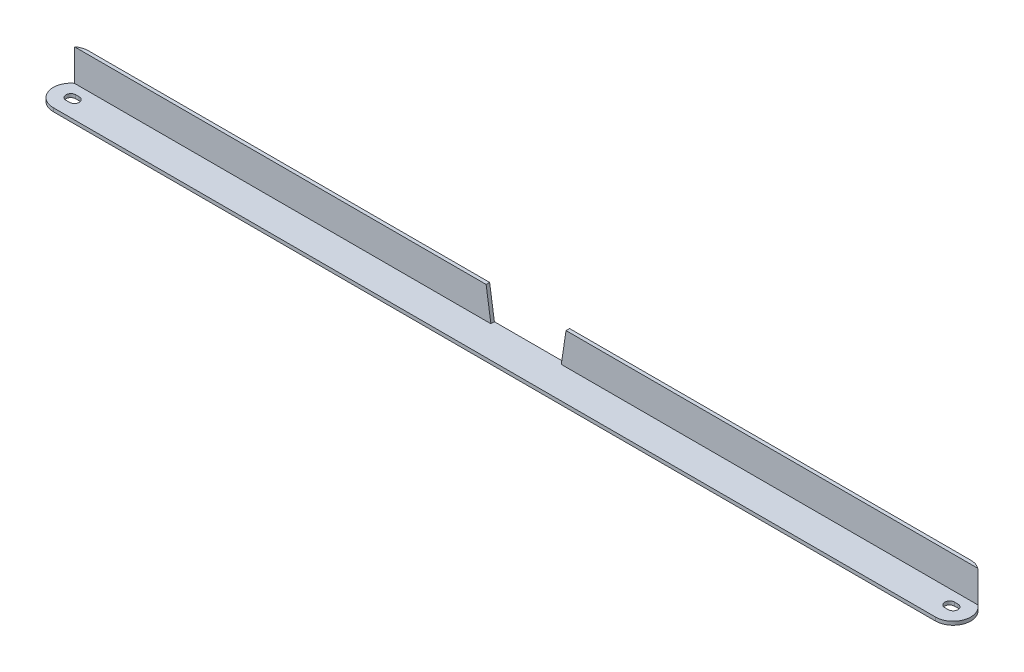
ISO-10303-21;
HEADER;
FILE_DESCRIPTION(('STEP AP214'),'2;1');
FILE_NAME('part.step','',(''),(''),'','','');
FILE_SCHEMA(('AUTOMOTIVE_DESIGN { 1 0 10303 214 1 1 1 1 }'));
ENDSEC;
DATA;
#1=APPLICATION_CONTEXT('core data for automotive mechanical design processes');
#2=APPLICATION_PROTOCOL_DEFINITION('international standard','automotive_design',2000,#1);
#3=PRODUCT_CONTEXT('',#1,'mechanical');
#4=PRODUCT('Part','Part','',(#3));
#5=PRODUCT_RELATED_PRODUCT_CATEGORY('part','',(#4));
#6=PRODUCT_DEFINITION_FORMATION('','',#4);
#7=PRODUCT_DEFINITION_CONTEXT('part definition',#1,'design');
#8=PRODUCT_DEFINITION('design','',#6,#7);
#9=PRODUCT_DEFINITION_SHAPE('','',#8);
#10=(LENGTH_UNIT() NAMED_UNIT(*) SI_UNIT(.MILLI.,.METRE.));
#11=(NAMED_UNIT(*) PLANE_ANGLE_UNIT() SI_UNIT($,.RADIAN.));
#12=(NAMED_UNIT(*) SI_UNIT($,.STERADIAN.) SOLID_ANGLE_UNIT());
#13=UNCERTAINTY_MEASURE_WITH_UNIT(LENGTH_MEASURE(1.E-05),#10,'distance_accuracy_value','');
#14=(GEOMETRIC_REPRESENTATION_CONTEXT(3) GLOBAL_UNCERTAINTY_ASSIGNED_CONTEXT((#13)) GLOBAL_UNIT_ASSIGNED_CONTEXT((#10,
#11,#12)) REPRESENTATION_CONTEXT('',''));
#15=CARTESIAN_POINT('',(0.,0.,0.));
#16=DIRECTION('',(0.,0.,1.));
#17=DIRECTION('',(1.,0.,0.));
#18=AXIS2_PLACEMENT_3D('',#15,#16,#17);
#19=CARTESIAN_POINT('',(270.,10.,-8.));
#20=DIRECTION('',(0.,-1.,0.));
#21=DIRECTION('',(0.,0.,-1.));
#22=AXIS2_PLACEMENT_3D('',#19,#20,#21);
#23=PLANE('',#22);
#24=DIRECTION('',(-1.,0.,0.));
#25=VECTOR('',#24,1.);
#26=CARTESIAN_POINT('',(270.,10.,-10.));
#27=LINE('',#26,#25);
#28=CARTESIAN_POINT('',(250.65,10.,-9.99999999999998));
#29=VERTEX_POINT('',#28);
#30=CARTESIAN_POINT('',(22.7060216284856,10.,-10.));
#31=VERTEX_POINT('',#30);
#32=EDGE_CURVE('E12',#29,#31,#27,.T.);
#33=ORIENTED_EDGE('',*,*,#32,.T.);
#34=DIRECTION('',(0.,0.,1.));
#35=VECTOR('',#34,1.);
#36=CARTESIAN_POINT('',(22.7060216284856,10.,-10.));
#37=LINE('',#36,#35);
#38=CARTESIAN_POINT('',(22.7060216284856,10.,-8.));
#39=VERTEX_POINT('',#38);
#40=EDGE_CURVE('E261',#31,#39,#37,.T.);
#41=ORIENTED_EDGE('',*,*,#40,.T.);
#42=DIRECTION('',(-1.,0.,0.));
#43=VECTOR('',#42,1.);
#44=CARTESIAN_POINT('',(270.,10.,-8.));
#45=LINE('',#44,#43);
#46=CARTESIAN_POINT('',(256.65,10.,-8.));
#47=VERTEX_POINT('',#46);
#48=EDGE_CURVE('E285',#47,#39,#45,.T.);
#49=ORIENTED_EDGE('',*,*,#48,.F.);
#50=CARTESIAN_POINT('',(250.65,10.,0.));
#51=DIRECTION('',(0.,1.,0.));
#52=DIRECTION('',(0.,0.,1.));
#53=AXIS2_PLACEMENT_3D('',#50,#51,#52);
#54=CIRCLE('',#53,9.99999999999998);
#55=EDGE_CURVE('E284',#47,#29,#54,.T.);
#56=ORIENTED_EDGE('',*,*,#55,.T.);
#57=EDGE_LOOP('',(#33,#41,#49,#56));
#58=FACE_BOUND('',#57,.T.);
#59=ADVANCED_FACE('F134',(#58),#23,.F.);
#60=CARTESIAN_POINT('',(270.,10.,-8.));
#61=DIRECTION('',(0.,0.,-1.));
#62=DIRECTION('',(0.,1.,0.));
#63=AXIS2_PLACEMENT_3D('',#60,#61,#62);
#64=PLANE('',#63);
#65=ORIENTED_EDGE('',*,*,#48,.T.);
#66=DIRECTION('',(0.148663982875954,0.988887769261739,0.));
#67=VECTOR('',#66,1.);
#68=CARTESIAN_POINT('',(19.9999999999999,-8.,-8.));
#69=LINE('',#68,#67);
#70=CARTESIAN_POINT('',(19.9999999999999,-8.,-8.));
#71=VERTEX_POINT('',#70);
#72=EDGE_CURVE('E267',#71,#39,#69,.T.);
#73=ORIENTED_EDGE('',*,*,#72,.F.);
#74=DIRECTION('',(-1.,0.,0.));
#75=VECTOR('',#74,1.);
#76=CARTESIAN_POINT('',(270.,-8.,-8.));
#77=LINE('',#76,#75);
#78=CARTESIAN_POINT('',(256.65,-8.,-8.));
#79=VERTEX_POINT('',#78);
#80=EDGE_CURVE('E360',#79,#71,#77,.T.);
#81=ORIENTED_EDGE('',*,*,#80,.F.);
#82=DIRECTION('',(0.,1.,0.));
#83=VECTOR('',#82,1.);
#84=CARTESIAN_POINT('',(256.65,-10.,-8.));
#85=LINE('',#84,#83);
#86=EDGE_CURVE('E344',#47,#79,#85,.F.);
#87=ORIENTED_EDGE('',*,*,#86,.F.);
#88=EDGE_LOOP('',(#65,#73,#81,#87));
#89=FACE_BOUND('',#88,.T.);
#90=ADVANCED_FACE('F498',(#89),#64,.F.);
#91=CARTESIAN_POINT('',(270.,10.,-10.));
#92=DIRECTION('',(0.,0.,1.));
#93=DIRECTION('',(1.,0.,0.));
#94=AXIS2_PLACEMENT_3D('',#91,#92,#93);
#95=PLANE('',#94);
#96=DIRECTION('',(1.,0.,0.));
#97=VECTOR('',#96,1.);
#98=CARTESIAN_POINT('',(-19.9999999999999,-8.,-10.));
#99=LINE('',#98,#97);
#100=CARTESIAN_POINT('',(-19.9999999999999,-8.,-10.));
#101=VERTEX_POINT('',#100);
#102=CARTESIAN_POINT('',(19.9999999999999,-8.,-10.));
#103=VERTEX_POINT('',#102);
#104=EDGE_CURVE('E272',#101,#103,#99,.T.);
#105=ORIENTED_EDGE('',*,*,#104,.T.);
#106=DIRECTION('',(0.148663982875954,0.988887769261739,0.));
#107=VECTOR('',#106,1.);
#108=CARTESIAN_POINT('',(19.9999999999999,-8.,-10.));
#109=LINE('',#108,#107);
#110=EDGE_CURVE('E264',#103,#31,#109,.T.);
#111=ORIENTED_EDGE('',*,*,#110,.T.);
#112=ORIENTED_EDGE('',*,*,#32,.F.);
#113=DIRECTION('',(0.,1.,0.));
#114=VECTOR('',#113,1.);
#115=CARTESIAN_POINT('',(250.65,-10.,-9.99999999999998));
#116=LINE('',#115,#114);
#117=CARTESIAN_POINT('',(250.65,-10.,-9.99999999999998));
#118=VERTEX_POINT('',#117);
#119=EDGE_CURVE('E297',#118,#29,#116,.T.);
#120=ORIENTED_EDGE('',*,*,#119,.F.);
#121=DIRECTION('',(-1.,0.,0.));
#122=VECTOR('',#121,1.);
#123=CARTESIAN_POINT('',(270.,-10.,-10.));
#124=LINE('',#123,#122);
#125=CARTESIAN_POINT('',(-250.65,-10.,-9.99999999999998));
#126=VERTEX_POINT('',#125);
#127=EDGE_CURVE('E347',#118,#126,#124,.T.);
#128=ORIENTED_EDGE('',*,*,#127,.T.);
#129=DIRECTION('',(0.,1.,0.));
#130=VECTOR('',#129,1.);
#131=CARTESIAN_POINT('',(-250.65,-10.,-9.99999999999998));
#132=LINE('',#131,#130);
#133=CARTESIAN_POINT('',(-250.65,10.,-9.99999999999998));
#134=VERTEX_POINT('',#133);
#135=EDGE_CURVE('E403',#126,#134,#132,.T.);
#136=ORIENTED_EDGE('',*,*,#135,.T.);
#137=CARTESIAN_POINT('',(-22.7060216284856,10.,-10.));
#138=VERTEX_POINT('',#137);
#139=EDGE_CURVE('E143',#138,#134,#27,.T.);
#140=ORIENTED_EDGE('',*,*,#139,.F.);
#141=DIRECTION('',(0.148663982875954,-0.988887769261739,0.));
#142=VECTOR('',#141,1.);
#143=CARTESIAN_POINT('',(-19.9999999999999,-8.,-10.));
#144=LINE('',#143,#142);
#145=EDGE_CURVE('E280',#138,#101,#144,.T.);
#146=ORIENTED_EDGE('',*,*,#145,.T.);
#147=EDGE_LOOP('',(#105,#111,#112,#120,#128,#136,#140,#146));
#148=FACE_BOUND('',#147,.T.);
#149=ADVANCED_FACE('F136',(#148),#95,.F.);
#150=CARTESIAN_POINT('',(-22.7060216284856,10.,-8.));
#151=VERTEX_POINT('',#150);
#152=CARTESIAN_POINT('',(-256.65,10.,-8.));
#153=VERTEX_POINT('',#152);
#154=EDGE_CURVE('E363',#151,#153,#45,.T.);
#155=ORIENTED_EDGE('',*,*,#154,.F.);
#156=DIRECTION('',(0.,0.,1.));
#157=VECTOR('',#156,1.);
#158=CARTESIAN_POINT('',(-22.7060216284856,10.,-10.));
#159=LINE('',#158,#157);
#160=EDGE_CURVE('E150',#138,#151,#159,.T.);
#161=ORIENTED_EDGE('',*,*,#160,.F.);
#162=ORIENTED_EDGE('',*,*,#139,.T.);
#163=CARTESIAN_POINT('',(-250.65,10.,0.));
#164=DIRECTION('',(0.,-1.,0.));
#165=DIRECTION('',(0.,0.,1.));
#166=AXIS2_PLACEMENT_3D('',#163,#164,#165);
#167=CIRCLE('',#166,9.99999999999998);
#168=EDGE_CURVE('E381',#153,#134,#167,.T.);
#169=ORIENTED_EDGE('',*,*,#168,.F.);
#170=EDGE_LOOP('',(#155,#161,#162,#169));
#171=FACE_BOUND('',#170,.T.);
#172=ADVANCED_FACE('F388',(#171),#23,.F.);
#173=CARTESIAN_POINT('',(270.,-8.,10.));
#174=DIRECTION('',(0.,-1.,0.));
#175=DIRECTION('',(0.,0.,-1.));
#176=AXIS2_PLACEMENT_3D('',#173,#174,#175);
#177=PLANE('',#176);
#178=ORIENTED_EDGE('',*,*,#80,.T.);
#179=DIRECTION('',(0.,0.,1.));
#180=VECTOR('',#179,1.);
#181=CARTESIAN_POINT('',(19.9999999999999,-8.,-10.));
#182=LINE('',#181,#180);
#183=EDGE_CURVE('E392',#103,#71,#182,.T.);
#184=ORIENTED_EDGE('',*,*,#183,.F.);
#185=ORIENTED_EDGE('',*,*,#104,.F.);
#186=DIRECTION('',(0.,0.,1.));
#187=VECTOR('',#186,1.);
#188=CARTESIAN_POINT('',(-19.9999999999999,-8.,-10.));
#189=LINE('',#188,#187);
#190=CARTESIAN_POINT('',(-19.9999999999999,-8.,-8.));
#191=VERTEX_POINT('',#190);
#192=EDGE_CURVE('E399',#101,#191,#189,.T.);
#193=ORIENTED_EDGE('',*,*,#192,.T.);
#194=CARTESIAN_POINT('',(-256.65,-8.,-8.));
#195=VERTEX_POINT('',#194);
#196=EDGE_CURVE('E359',#191,#195,#77,.T.);
#197=ORIENTED_EDGE('',*,*,#196,.T.);
#198=CARTESIAN_POINT('',(-250.65,-8.,0.));
#199=DIRECTION('',(0.,-1.,0.));
#200=DIRECTION('',(0.,0.,-1.));
#201=AXIS2_PLACEMENT_3D('',#198,#199,#200);
#202=CIRCLE('',#201,9.99999999999998);
#203=CARTESIAN_POINT('',(-250.65,-8.,9.99999999999998));
#204=VERTEX_POINT('',#203);
#205=EDGE_CURVE('E384',#195,#204,#202,.F.);
#206=ORIENTED_EDGE('',*,*,#205,.T.);
#207=DIRECTION('',(-1.,0.,0.));
#208=VECTOR('',#207,1.);
#209=CARTESIAN_POINT('',(270.,-8.,10.));
#210=LINE('',#209,#208);
#211=CARTESIAN_POINT('',(250.65,-8.,9.99999999999998));
#212=VERTEX_POINT('',#211);
#213=EDGE_CURVE('E355',#212,#204,#210,.T.);
#214=ORIENTED_EDGE('',*,*,#213,.F.);
#215=CARTESIAN_POINT('',(250.65,-8.,0.));
#216=DIRECTION('',(0.,-1.,0.));
#217=DIRECTION('',(0.,0.,-1.));
#218=AXIS2_PLACEMENT_3D('',#215,#216,#217);
#219=CIRCLE('',#218,9.99999999999998);
#220=EDGE_CURVE('E341',#79,#212,#219,.T.);
#221=ORIENTED_EDGE('',*,*,#220,.F.);
#222=EDGE_LOOP('',(#178,#184,#185,#193,#197,#206,#214,#221));
#223=FACE_BOUND('',#222,.T.);
#224=DIRECTION('',(-1.,0.,0.));
#225=VECTOR('',#224,1.);
#226=CARTESIAN_POINT('',(270.,-8.,2.75));
#227=LINE('',#226,#225);
#228=CARTESIAN_POINT('',(250.65,-8.,2.75));
#229=VERTEX_POINT('',#228);
#230=CARTESIAN_POINT('',(248.65,-8.,2.75));
#231=VERTEX_POINT('',#230);
#232=EDGE_CURVE('E316',#229,#231,#227,.T.);
#233=ORIENTED_EDGE('',*,*,#232,.T.);
#234=CARTESIAN_POINT('',(248.65,-8.,0.));
#235=DIRECTION('',(0.,-1.,0.));
#236=DIRECTION('',(0.,0.,-1.));
#237=AXIS2_PLACEMENT_3D('',#234,#235,#236);
#238=CIRCLE('',#237,2.75);
#239=CARTESIAN_POINT('',(248.65,-8.,-2.75));
#240=VERTEX_POINT('',#239);
#241=EDGE_CURVE('E337',#231,#240,#238,.T.);
#242=ORIENTED_EDGE('',*,*,#241,.T.);
#243=DIRECTION('',(-1.,0.,0.));
#244=VECTOR('',#243,1.);
#245=CARTESIAN_POINT('',(270.,-8.,-2.75000000000001));
#246=LINE('',#245,#244);
#247=CARTESIAN_POINT('',(250.65,-8.,-2.75));
#248=VERTEX_POINT('',#247);
#249=EDGE_CURVE('E334',#248,#240,#246,.T.);
#250=ORIENTED_EDGE('',*,*,#249,.F.);
#251=CARTESIAN_POINT('',(250.65,-8.,0.));
#252=DIRECTION('',(0.,-1.,0.));
#253=DIRECTION('',(0.,0.,-1.));
#254=AXIS2_PLACEMENT_3D('',#251,#252,#253);
#255=CIRCLE('',#254,2.75);
#256=EDGE_CURVE('E330',#248,#229,#255,.T.);
#257=ORIENTED_EDGE('',*,*,#256,.T.);
#258=EDGE_LOOP('',(#233,#242,#250,#257));
#259=FACE_BOUND('',#258,.T.);
#260=CARTESIAN_POINT('',(-248.65,-8.,0.));
#261=DIRECTION('',(0.,-1.,0.));
#262=DIRECTION('',(0.,0.,-1.));
#263=AXIS2_PLACEMENT_3D('',#260,#261,#262);
#264=CIRCLE('',#263,2.75);
#265=CARTESIAN_POINT('',(-248.65,-8.,2.75));
#266=VERTEX_POINT('',#265);
#267=CARTESIAN_POINT('',(-248.65,-8.,-2.75));
#268=VERTEX_POINT('',#267);
#269=EDGE_CURVE('E447',#266,#268,#264,.F.);
#270=ORIENTED_EDGE('',*,*,#269,.F.);
#271=DIRECTION('',(1.,0.,0.));
#272=VECTOR('',#271,1.);
#273=CARTESIAN_POINT('',(270.,-8.,2.75000000000011));
#274=LINE('',#273,#272);
#275=CARTESIAN_POINT('',(-250.65,-8.,2.75));
#276=VERTEX_POINT('',#275);
#277=EDGE_CURVE('E444',#276,#266,#274,.T.);
#278=ORIENTED_EDGE('',*,*,#277,.F.);
#279=CARTESIAN_POINT('',(-250.65,-8.,0.));
#280=DIRECTION('',(0.,-1.,0.));
#281=DIRECTION('',(0.,0.,-1.));
#282=AXIS2_PLACEMENT_3D('',#279,#280,#281);
#283=CIRCLE('',#282,2.75);
#284=CARTESIAN_POINT('',(-250.65,-8.,-2.75));
#285=VERTEX_POINT('',#284);
#286=EDGE_CURVE('E441',#285,#276,#283,.F.);
#287=ORIENTED_EDGE('',*,*,#286,.F.);
#288=DIRECTION('',(1.,0.,0.));
#289=VECTOR('',#288,1.);
#290=CARTESIAN_POINT('',(270.,-8.,-2.74999999999989));
#291=LINE('',#290,#289);
#292=EDGE_CURVE('E386',#285,#268,#291,.T.);
#293=ORIENTED_EDGE('',*,*,#292,.T.);
#294=EDGE_LOOP('',(#270,#278,#287,#293));
#295=FACE_BOUND('',#294,.T.);
#296=ADVANCED_FACE('F462',(#223,#259,#295),#177,.F.);
#297=CARTESIAN_POINT('',(270.,-10.,10.));
#298=DIRECTION('',(0.,1.,0.));
#299=DIRECTION('',(0.,0.,1.));
#300=AXIS2_PLACEMENT_3D('',#297,#298,#299);
#301=PLANE('',#300);
#302=DIRECTION('',(-1.,0.,0.));
#303=VECTOR('',#302,1.);
#304=CARTESIAN_POINT('',(270.,-10.,10.));
#305=LINE('',#304,#303);
#306=CARTESIAN_POINT('',(250.65,-10.,10.));
#307=VERTEX_POINT('',#306);
#308=CARTESIAN_POINT('',(-250.65,-10.,10.));
#309=VERTEX_POINT('',#308);
#310=EDGE_CURVE('E351',#307,#309,#305,.T.);
#311=ORIENTED_EDGE('',*,*,#310,.T.);
#312=CARTESIAN_POINT('',(-250.65,-10.,0.));
#313=DIRECTION('',(0.,-1.,0.));
#314=DIRECTION('',(0.,0.,1.));
#315=AXIS2_PLACEMENT_3D('',#312,#313,#314);
#316=CIRCLE('',#315,9.99999999999998);
#317=EDGE_CURVE('E391',#309,#126,#316,.T.);
#318=ORIENTED_EDGE('',*,*,#317,.T.);
#319=ORIENTED_EDGE('',*,*,#127,.F.);
#320=CARTESIAN_POINT('',(250.65,-10.,0.));
#321=DIRECTION('',(0.,1.,0.));
#322=DIRECTION('',(0.,0.,1.));
#323=AXIS2_PLACEMENT_3D('',#320,#321,#322);
#324=CIRCLE('',#323,9.99999999999998);
#325=EDGE_CURVE('E290',#307,#118,#324,.T.);
#326=ORIENTED_EDGE('',*,*,#325,.F.);
#327=EDGE_LOOP('',(#311,#318,#319,#326));
#328=FACE_BOUND('',#327,.T.);
#329=DIRECTION('',(1.,0.,0.));
#330=VECTOR('',#329,1.);
#331=CARTESIAN_POINT('',(248.65,-10.,-2.75));
#332=LINE('',#331,#330);
#333=CARTESIAN_POINT('',(248.65,-10.,-2.75));
#334=VERTEX_POINT('',#333);
#335=CARTESIAN_POINT('',(250.65,-10.,-2.75));
#336=VERTEX_POINT('',#335);
#337=EDGE_CURVE('E308',#334,#336,#332,.T.);
#338=ORIENTED_EDGE('',*,*,#337,.F.);
#339=CARTESIAN_POINT('',(248.65,-10.,0.));
#340=DIRECTION('',(0.,1.,0.));
#341=DIRECTION('',(0.,0.,1.));
#342=AXIS2_PLACEMENT_3D('',#339,#340,#341);
#343=CIRCLE('',#342,2.75);
#344=CARTESIAN_POINT('',(248.65,-10.,2.75));
#345=VERTEX_POINT('',#344);
#346=EDGE_CURVE('E289',#334,#345,#343,.T.);
#347=ORIENTED_EDGE('',*,*,#346,.T.);
#348=DIRECTION('',(1.,0.,0.));
#349=VECTOR('',#348,1.);
#350=CARTESIAN_POINT('',(248.65,-10.,2.75));
#351=LINE('',#350,#349);
#352=CARTESIAN_POINT('',(250.65,-10.,2.75));
#353=VERTEX_POINT('',#352);
#354=EDGE_CURVE('E295',#345,#353,#351,.T.);
#355=ORIENTED_EDGE('',*,*,#354,.T.);
#356=CARTESIAN_POINT('',(250.65,-10.,0.));
#357=DIRECTION('',(0.,1.,0.));
#358=DIRECTION('',(0.,0.,1.));
#359=AXIS2_PLACEMENT_3D('',#356,#357,#358);
#360=CIRCLE('',#359,2.75);
#361=EDGE_CURVE('E304',#353,#336,#360,.T.);
#362=ORIENTED_EDGE('',*,*,#361,.T.);
#363=EDGE_LOOP('',(#338,#347,#355,#362));
#364=FACE_BOUND('',#363,.T.);
#365=CARTESIAN_POINT('',(-248.65,-10.,0.));
#366=DIRECTION('',(0.,-1.,0.));
#367=DIRECTION('',(0.,0.,1.));
#368=AXIS2_PLACEMENT_3D('',#365,#366,#367);
#369=CIRCLE('',#368,2.75);
#370=CARTESIAN_POINT('',(-248.65,-10.,-2.75));
#371=VERTEX_POINT('',#370);
#372=CARTESIAN_POINT('',(-248.65,-10.,2.75));
#373=VERTEX_POINT('',#372);
#374=EDGE_CURVE('E406',#371,#373,#369,.T.);
#375=ORIENTED_EDGE('',*,*,#374,.F.);
#376=DIRECTION('',(-1.,0.,0.));
#377=VECTOR('',#376,1.);
#378=CARTESIAN_POINT('',(-248.65,-10.,-2.75));
#379=LINE('',#378,#377);
#380=CARTESIAN_POINT('',(-250.65,-10.,-2.75));
#381=VERTEX_POINT('',#380);
#382=EDGE_CURVE('E411',#371,#381,#379,.T.);
#383=ORIENTED_EDGE('',*,*,#382,.T.);
#384=CARTESIAN_POINT('',(-250.65,-10.,0.));
#385=DIRECTION('',(0.,-1.,0.));
#386=DIRECTION('',(0.,0.,1.));
#387=AXIS2_PLACEMENT_3D('',#384,#385,#386);
#388=CIRCLE('',#387,2.75);
#389=CARTESIAN_POINT('',(-250.65,-10.,2.75));
#390=VERTEX_POINT('',#389);
#391=EDGE_CURVE('E415',#390,#381,#388,.T.);
#392=ORIENTED_EDGE('',*,*,#391,.F.);
#393=DIRECTION('',(-1.,0.,0.));
#394=VECTOR('',#393,1.);
#395=CARTESIAN_POINT('',(-248.65,-10.,2.75));
#396=LINE('',#395,#394);
#397=EDGE_CURVE('E419',#373,#390,#396,.T.);
#398=ORIENTED_EDGE('',*,*,#397,.F.);
#399=EDGE_LOOP('',(#375,#383,#392,#398));
#400=FACE_BOUND('',#399,.T.);
#401=ADVANCED_FACE('F480',(#328,#364,#400),#301,.F.);
#402=ORIENTED_EDGE('',*,*,#196,.F.);
#403=DIRECTION('',(0.148663982875954,-0.988887769261739,0.));
#404=VECTOR('',#403,1.);
#405=CARTESIAN_POINT('',(-19.9999999999999,-8.,-8.));
#406=LINE('',#405,#404);
#407=EDGE_CURVE('E281',#151,#191,#406,.T.);
#408=ORIENTED_EDGE('',*,*,#407,.F.);
#409=ORIENTED_EDGE('',*,*,#154,.T.);
#410=DIRECTION('',(0.,1.,0.));
#411=VECTOR('',#410,1.);
#412=CARTESIAN_POINT('',(-256.65,-10.,-8.));
#413=LINE('',#412,#411);
#414=EDGE_CURVE('E374',#153,#195,#413,.F.);
#415=ORIENTED_EDGE('',*,*,#414,.T.);
#416=EDGE_LOOP('',(#402,#408,#409,#415));
#417=FACE_BOUND('',#416,.T.);
#418=ADVANCED_FACE('F373',(#417),#64,.F.);
#419=CARTESIAN_POINT('',(270.,-8.,10.));
#420=DIRECTION('',(0.,0.,-1.));
#421=DIRECTION('',(0.,1.,0.));
#422=AXIS2_PLACEMENT_3D('',#419,#420,#421);
#423=PLANE('',#422);
#424=ORIENTED_EDGE('',*,*,#213,.T.);
#425=DIRECTION('',(0.,1.,0.));
#426=VECTOR('',#425,1.);
#427=CARTESIAN_POINT('',(-250.65,-10.,9.99999999999998));
#428=LINE('',#427,#426);
#429=EDGE_CURVE('E397',#309,#204,#428,.T.);
#430=ORIENTED_EDGE('',*,*,#429,.F.);
#431=ORIENTED_EDGE('',*,*,#310,.F.);
#432=DIRECTION('',(0.,1.,0.));
#433=VECTOR('',#432,1.);
#434=CARTESIAN_POINT('',(250.65,-10.,9.99999999999998));
#435=LINE('',#434,#433);
#436=EDGE_CURVE('E450',#307,#212,#435,.T.);
#437=ORIENTED_EDGE('',*,*,#436,.T.);
#438=EDGE_LOOP('',(#424,#430,#431,#437));
#439=FACE_BOUND('',#438,.T.);
#440=ADVANCED_FACE('F457',(#439),#423,.F.);
#441=CARTESIAN_POINT('',(248.65,-10.,0.));
#442=DIRECTION('',(0.,1.,0.));
#443=DIRECTION('',(0.,0.,1.));
#444=AXIS2_PLACEMENT_3D('',#441,#442,#443);
#445=CYLINDRICAL_SURFACE('',#444,2.75);
#446=DIRECTION('',(0.,1.,0.));
#447=VECTOR('',#446,1.);
#448=CARTESIAN_POINT('',(248.65,-10.,2.75));
#449=LINE('',#448,#447);
#450=EDGE_CURVE('E311',#345,#231,#449,.T.);
#451=ORIENTED_EDGE('',*,*,#450,.F.);
#452=ORIENTED_EDGE('',*,*,#346,.F.);
#453=DIRECTION('',(0.,1.,0.));
#454=VECTOR('',#453,1.);
#455=CARTESIAN_POINT('',(248.65,-10.,-2.75));
#456=LINE('',#455,#454);
#457=EDGE_CURVE('E312',#334,#240,#456,.T.);
#458=ORIENTED_EDGE('',*,*,#457,.T.);
#459=ORIENTED_EDGE('',*,*,#241,.F.);
#460=EDGE_LOOP('',(#451,#452,#458,#459));
#461=FACE_BOUND('',#460,.T.);
#462=ADVANCED_FACE('F573',(#461),#445,.F.);
#463=CARTESIAN_POINT('',(248.65,-10.,-2.75));
#464=DIRECTION('',(0.,0.,1.));
#465=DIRECTION('',(1.,0.,0.));
#466=AXIS2_PLACEMENT_3D('',#463,#464,#465);
#467=PLANE('',#466);
#468=ORIENTED_EDGE('',*,*,#249,.T.);
#469=ORIENTED_EDGE('',*,*,#457,.F.);
#470=ORIENTED_EDGE('',*,*,#337,.T.);
#471=DIRECTION('',(0.,1.,0.));
#472=VECTOR('',#471,1.);
#473=CARTESIAN_POINT('',(250.65,-10.,-2.75));
#474=LINE('',#473,#472);
#475=EDGE_CURVE('E317',#336,#248,#474,.T.);
#476=ORIENTED_EDGE('',*,*,#475,.T.);
#477=EDGE_LOOP('',(#468,#469,#470,#476));
#478=FACE_BOUND('',#477,.T.);
#479=ADVANCED_FACE('F604',(#478),#467,.T.);
#480=CARTESIAN_POINT('',(250.65,-10.,0.));
#481=DIRECTION('',(0.,1.,0.));
#482=DIRECTION('',(0.,0.,1.));
#483=AXIS2_PLACEMENT_3D('',#480,#481,#482);
#484=CYLINDRICAL_SURFACE('',#483,2.75);
#485=ORIENTED_EDGE('',*,*,#475,.F.);
#486=ORIENTED_EDGE('',*,*,#361,.F.);
#487=DIRECTION('',(0.,1.,0.));
#488=VECTOR('',#487,1.);
#489=CARTESIAN_POINT('',(250.65,-10.,2.75));
#490=LINE('',#489,#488);
#491=EDGE_CURVE('E321',#353,#229,#490,.T.);
#492=ORIENTED_EDGE('',*,*,#491,.T.);
#493=ORIENTED_EDGE('',*,*,#256,.F.);
#494=EDGE_LOOP('',(#485,#486,#492,#493));
#495=FACE_BOUND('',#494,.T.);
#496=ADVANCED_FACE('F492',(#495),#484,.F.);
#497=CARTESIAN_POINT('',(248.65,-10.,2.75));
#498=DIRECTION('',(0.,0.,1.));
#499=DIRECTION('',(1.,0.,0.));
#500=AXIS2_PLACEMENT_3D('',#497,#498,#499);
#501=PLANE('',#500);
#502=ORIENTED_EDGE('',*,*,#491,.F.);
#503=ORIENTED_EDGE('',*,*,#354,.F.);
#504=ORIENTED_EDGE('',*,*,#450,.T.);
#505=ORIENTED_EDGE('',*,*,#232,.F.);
#506=EDGE_LOOP('',(#502,#503,#504,#505));
#507=FACE_BOUND('',#506,.T.);
#508=ADVANCED_FACE('F484',(#507),#501,.F.);
#509=CARTESIAN_POINT('',(250.65,-10.,0.));
#510=DIRECTION('',(0.,1.,0.));
#511=DIRECTION('',(0.,0.,1.));
#512=AXIS2_PLACEMENT_3D('',#509,#510,#511);
#513=CYLINDRICAL_SURFACE('',#512,9.99999999999998);
#514=ORIENTED_EDGE('',*,*,#86,.T.);
#515=ORIENTED_EDGE('',*,*,#220,.T.);
#516=ORIENTED_EDGE('',*,*,#436,.F.);
#517=ORIENTED_EDGE('',*,*,#325,.T.);
#518=ORIENTED_EDGE('',*,*,#119,.T.);
#519=ORIENTED_EDGE('',*,*,#55,.F.);
#520=EDGE_LOOP('',(#514,#515,#516,#517,#518,#519));
#521=FACE_BOUND('',#520,.T.);
#522=ADVANCED_FACE('F482',(#521),#513,.T.);
#523=CARTESIAN_POINT('',(-250.65,-10.,0.));
#524=DIRECTION('',(0.,1.,0.));
#525=DIRECTION('',(0.,0.,1.));
#526=AXIS2_PLACEMENT_3D('',#523,#524,#525);
#527=CYLINDRICAL_SURFACE('',#526,9.99999999999998);
#528=ORIENTED_EDGE('',*,*,#168,.T.);
#529=ORIENTED_EDGE('',*,*,#135,.F.);
#530=ORIENTED_EDGE('',*,*,#317,.F.);
#531=ORIENTED_EDGE('',*,*,#429,.T.);
#532=ORIENTED_EDGE('',*,*,#205,.F.);
#533=ORIENTED_EDGE('',*,*,#414,.F.);
#534=EDGE_LOOP('',(#528,#529,#530,#531,#532,#533));
#535=FACE_BOUND('',#534,.T.);
#536=ADVANCED_FACE('F380',(#535),#527,.T.);
#537=CARTESIAN_POINT('',(-248.65,-10.,0.));
#538=DIRECTION('',(0.,1.,0.));
#539=DIRECTION('',(0.,0.,1.));
#540=AXIS2_PLACEMENT_3D('',#537,#538,#539);
#541=CYLINDRICAL_SURFACE('',#540,2.75);
#542=ORIENTED_EDGE('',*,*,#269,.T.);
#543=DIRECTION('',(0.,1.,0.));
#544=VECTOR('',#543,1.);
#545=CARTESIAN_POINT('',(-248.65,-10.,-2.75));
#546=LINE('',#545,#544);
#547=EDGE_CURVE('E158',#371,#268,#546,.T.);
#548=ORIENTED_EDGE('',*,*,#547,.F.);
#549=ORIENTED_EDGE('',*,*,#374,.T.);
#550=DIRECTION('',(0.,1.,0.));
#551=VECTOR('',#550,1.);
#552=CARTESIAN_POINT('',(-248.65,-10.,2.75));
#553=LINE('',#552,#551);
#554=EDGE_CURVE('E422',#373,#266,#553,.T.);
#555=ORIENTED_EDGE('',*,*,#554,.T.);
#556=EDGE_LOOP('',(#542,#548,#549,#555));
#557=FACE_BOUND('',#556,.T.);
#558=ADVANCED_FACE('F490',(#557),#541,.F.);
#559=CARTESIAN_POINT('',(-248.65,-10.,2.75));
#560=DIRECTION('',(0.,0.,-1.));
#561=DIRECTION('',(-1.,0.,0.));
#562=AXIS2_PLACEMENT_3D('',#559,#560,#561);
#563=PLANE('',#562);
#564=ORIENTED_EDGE('',*,*,#277,.T.);
#565=ORIENTED_EDGE('',*,*,#554,.F.);
#566=ORIENTED_EDGE('',*,*,#397,.T.);
#567=DIRECTION('',(0.,1.,0.));
#568=VECTOR('',#567,1.);
#569=CARTESIAN_POINT('',(-250.65,-10.,2.75));
#570=LINE('',#569,#568);
#571=EDGE_CURVE('E426',#390,#276,#570,.T.);
#572=ORIENTED_EDGE('',*,*,#571,.T.);
#573=EDGE_LOOP('',(#564,#565,#566,#572));
#574=FACE_BOUND('',#573,.T.);
#575=ADVANCED_FACE('F540',(#574),#563,.T.);
#576=CARTESIAN_POINT('',(-250.65,-10.,0.));
#577=DIRECTION('',(0.,1.,0.));
#578=DIRECTION('',(0.,0.,1.));
#579=AXIS2_PLACEMENT_3D('',#576,#577,#578);
#580=CYLINDRICAL_SURFACE('',#579,2.75);
#581=ORIENTED_EDGE('',*,*,#286,.T.);
#582=ORIENTED_EDGE('',*,*,#571,.F.);
#583=ORIENTED_EDGE('',*,*,#391,.T.);
#584=DIRECTION('',(0.,1.,0.));
#585=VECTOR('',#584,1.);
#586=CARTESIAN_POINT('',(-250.65,-10.,-2.75));
#587=LINE('',#586,#585);
#588=EDGE_CURVE('E430',#381,#285,#587,.T.);
#589=ORIENTED_EDGE('',*,*,#588,.T.);
#590=EDGE_LOOP('',(#581,#582,#583,#589));
#591=FACE_BOUND('',#590,.T.);
#592=ADVANCED_FACE('F530',(#591),#580,.F.);
#593=CARTESIAN_POINT('',(-248.65,-10.,-2.75));
#594=DIRECTION('',(0.,0.,-1.));
#595=DIRECTION('',(-1.,0.,0.));
#596=AXIS2_PLACEMENT_3D('',#593,#594,#595);
#597=PLANE('',#596);
#598=ORIENTED_EDGE('',*,*,#588,.F.);
#599=ORIENTED_EDGE('',*,*,#382,.F.);
#600=ORIENTED_EDGE('',*,*,#547,.T.);
#601=ORIENTED_EDGE('',*,*,#292,.F.);
#602=EDGE_LOOP('',(#598,#599,#600,#601));
#603=FACE_BOUND('',#602,.T.);
#604=ADVANCED_FACE('F526',(#603),#597,.F.);
#605=CARTESIAN_POINT('',(19.9999999999999,-8.,-10.));
#606=DIRECTION('',(0.988887769261739,-0.148663982875954,0.));
#607=DIRECTION('',(0.148663982875954,0.988887769261739,0.));
#608=AXIS2_PLACEMENT_3D('',#605,#606,#607);
#609=PLANE('',#608);
#610=ORIENTED_EDGE('',*,*,#72,.T.);
#611=ORIENTED_EDGE('',*,*,#40,.F.);
#612=ORIENTED_EDGE('',*,*,#110,.F.);
#613=ORIENTED_EDGE('',*,*,#183,.T.);
#614=EDGE_LOOP('',(#610,#611,#612,#613));
#615=FACE_BOUND('',#614,.T.);
#616=ADVANCED_FACE('F263',(#615),#609,.F.);
#617=CARTESIAN_POINT('',(-19.9999999999999,-8.,-10.));
#618=DIRECTION('',(-0.988887769261739,-0.148663982875954,0.));
#619=DIRECTION('',(0.148663982875954,-0.988887769261739,0.));
#620=AXIS2_PLACEMENT_3D('',#617,#618,#619);
#621=PLANE('',#620);
#622=ORIENTED_EDGE('',*,*,#407,.T.);
#623=ORIENTED_EDGE('',*,*,#192,.F.);
#624=ORIENTED_EDGE('',*,*,#145,.F.);
#625=ORIENTED_EDGE('',*,*,#160,.T.);
#626=EDGE_LOOP('',(#622,#623,#624,#625));
#627=FACE_BOUND('',#626,.T.);
#628=ADVANCED_FACE('F468',(#627),#621,.F.);
#629=CLOSED_SHELL('',(#59,#90,#149,#172,#296,#401,#418,#440,#462,#479,#496,#508,#522,#536,#558,
#575,#592,#604,#616,#628));
#630=MANIFOLD_SOLID_BREP('B2',#629);
#631=ADVANCED_BREP_SHAPE_REPRESENTATION('',(#18,#630),#14);
#632=SHAPE_DEFINITION_REPRESENTATION(#9,#631);
ENDSEC;
END-ISO-10303-21;
